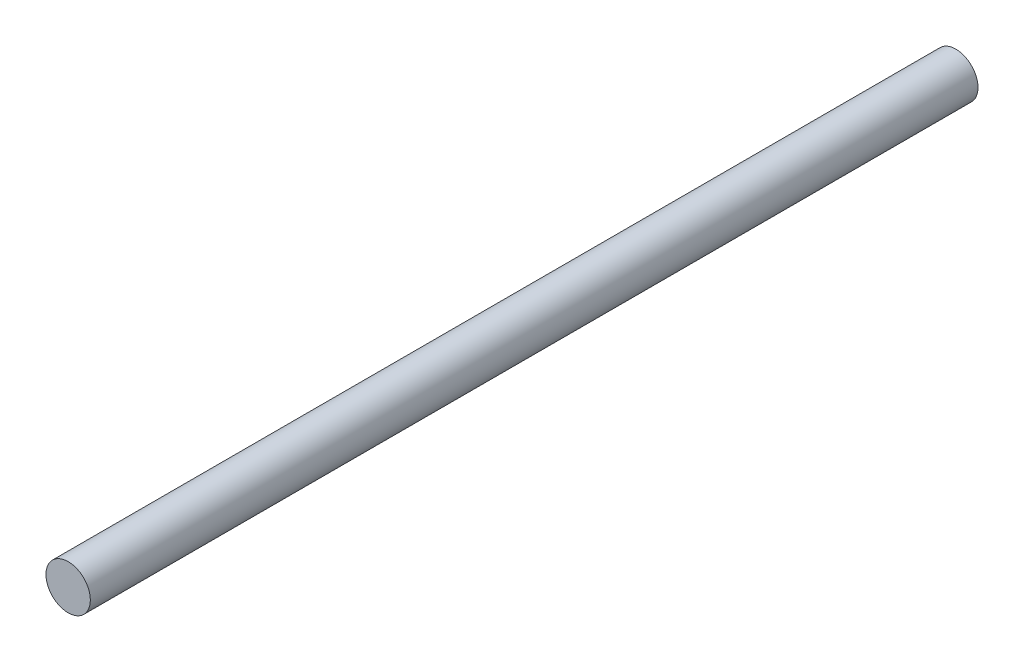
ISO-10303-21;
HEADER;
FILE_DESCRIPTION(('STEP AP214'),'2;1');
FILE_NAME('part.step','',(''),(''),'','','');
FILE_SCHEMA(('AUTOMOTIVE_DESIGN { 1 0 10303 214 1 1 1 1 }'));
ENDSEC;
DATA;
#1=APPLICATION_CONTEXT('core data for automotive mechanical design processes');
#2=APPLICATION_PROTOCOL_DEFINITION('international standard','automotive_design',2000,#1);
#3=PRODUCT_CONTEXT('',#1,'mechanical');
#4=PRODUCT('Part','Part','',(#3));
#5=PRODUCT_RELATED_PRODUCT_CATEGORY('part','',(#4));
#6=PRODUCT_DEFINITION_FORMATION('','',#4);
#7=PRODUCT_DEFINITION_CONTEXT('part definition',#1,'design');
#8=PRODUCT_DEFINITION('design','',#6,#7);
#9=PRODUCT_DEFINITION_SHAPE('','',#8);
#10=(LENGTH_UNIT() NAMED_UNIT(*) SI_UNIT(.MILLI.,.METRE.));
#11=(NAMED_UNIT(*) PLANE_ANGLE_UNIT() SI_UNIT($,.RADIAN.));
#12=(NAMED_UNIT(*) SI_UNIT($,.STERADIAN.) SOLID_ANGLE_UNIT());
#13=UNCERTAINTY_MEASURE_WITH_UNIT(LENGTH_MEASURE(1.E-05),#10,'distance_accuracy_value','');
#14=(GEOMETRIC_REPRESENTATION_CONTEXT(3) GLOBAL_UNCERTAINTY_ASSIGNED_CONTEXT((#13)) GLOBAL_UNIT_ASSIGNED_CONTEXT((#10,
#11,#12)) REPRESENTATION_CONTEXT('',''));
#15=CARTESIAN_POINT('',(0.,0.,0.));
#16=DIRECTION('',(0.,0.,1.));
#17=DIRECTION('',(1.,0.,0.));
#18=AXIS2_PLACEMENT_3D('',#15,#16,#17);
#19=CARTESIAN_POINT('',(0.,0.,-1600.));
#20=DIRECTION('',(0.,0.,1.));
#21=DIRECTION('',(1.,0.,0.));
#22=AXIS2_PLACEMENT_3D('',#19,#20,#21);
#23=CYLINDRICAL_SURFACE('',#22,40.);
#24=CARTESIAN_POINT('',(0.,0.,-1600.));
#25=DIRECTION('',(0.,0.,1.));
#26=DIRECTION('',(1.,0.,0.));
#27=AXIS2_PLACEMENT_3D('',#24,#25,#26);
#28=CIRCLE('',#27,40.);
#29=CARTESIAN_POINT('',(40.,0.,-1600.));
#30=VERTEX_POINT('',#29);
#31=EDGE_CURVE('E10',#30,#30,#28,.T.);
#32=ORIENTED_EDGE('',*,*,#31,.T.);
#33=EDGE_LOOP('',(#32));
#34=FACE_BOUND('',#33,.T.);
#35=CARTESIAN_POINT('',(0.,0.,0.));
#36=DIRECTION('',(0.,0.,1.));
#37=DIRECTION('',(1.,0.,0.));
#38=AXIS2_PLACEMENT_3D('',#35,#36,#37);
#39=CIRCLE('',#38,40.);
#40=CARTESIAN_POINT('',(40.,0.,0.));
#41=VERTEX_POINT('',#40);
#42=EDGE_CURVE('E34',#41,#41,#39,.T.);
#43=ORIENTED_EDGE('',*,*,#42,.F.);
#44=EDGE_LOOP('',(#43));
#45=FACE_BOUND('',#44,.T.);
#46=ADVANCED_FACE('F31',(#34,#45),#23,.T.);
#47=CARTESIAN_POINT('',(0.,0.,-1600.));
#48=DIRECTION('',(0.,0.,1.));
#49=DIRECTION('',(1.,0.,0.));
#50=AXIS2_PLACEMENT_3D('',#47,#48,#49);
#51=PLANE('',#50);
#52=ORIENTED_EDGE('',*,*,#31,.F.);
#53=EDGE_LOOP('',(#52));
#54=FACE_BOUND('',#53,.T.);
#55=ADVANCED_FACE('F46',(#54),#51,.F.);
#56=CARTESIAN_POINT('',(0.,0.,0.));
#57=DIRECTION('',(0.,0.,1.));
#58=DIRECTION('',(1.,0.,0.));
#59=AXIS2_PLACEMENT_3D('',#56,#57,#58);
#60=PLANE('',#59);
#61=ORIENTED_EDGE('',*,*,#42,.T.);
#62=EDGE_LOOP('',(#61));
#63=FACE_BOUND('',#62,.T.);
#64=ADVANCED_FACE('F43',(#63),#60,.T.);
#65=CLOSED_SHELL('',(#46,#55,#64));
#66=MANIFOLD_SOLID_BREP('B2',#65);
#67=ADVANCED_BREP_SHAPE_REPRESENTATION('',(#18,#66),#14);
#68=SHAPE_DEFINITION_REPRESENTATION(#9,#67);
ENDSEC;
END-ISO-10303-21;
